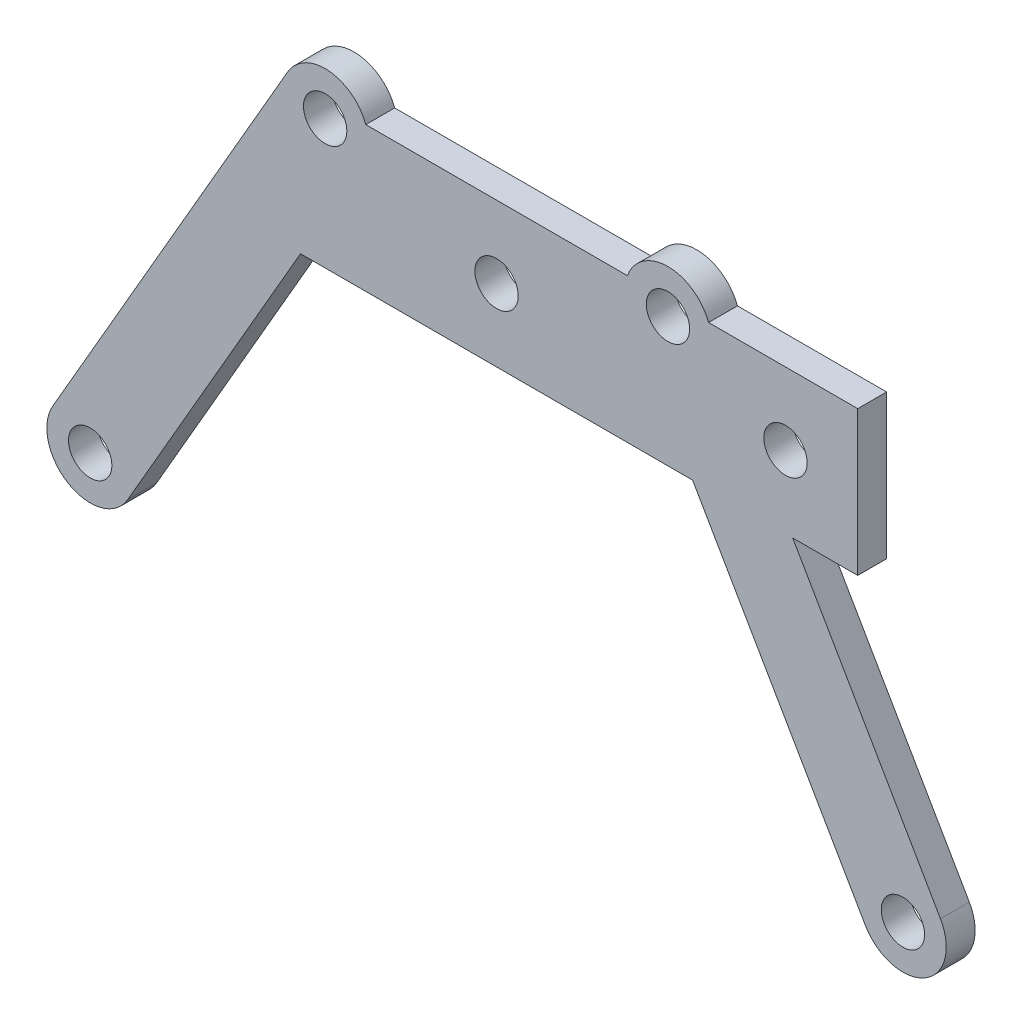
ISO-10303-21;
HEADER;
FILE_DESCRIPTION(('STEP AP214'),'2;1');
FILE_NAME('part.step','',(''),(''),'','','');
FILE_SCHEMA(('AUTOMOTIVE_DESIGN { 1 0 10303 214 1 1 1 1 }'));
ENDSEC;
DATA;
#1=APPLICATION_CONTEXT('core data for automotive mechanical design processes');
#2=APPLICATION_PROTOCOL_DEFINITION('international standard','automotive_design',2000,#1);
#3=PRODUCT_CONTEXT('',#1,'mechanical');
#4=PRODUCT('Part','Part','',(#3));
#5=PRODUCT_RELATED_PRODUCT_CATEGORY('part','',(#4));
#6=PRODUCT_DEFINITION_FORMATION('','',#4);
#7=PRODUCT_DEFINITION_CONTEXT('part definition',#1,'design');
#8=PRODUCT_DEFINITION('design','',#6,#7);
#9=PRODUCT_DEFINITION_SHAPE('','',#8);
#10=(LENGTH_UNIT() NAMED_UNIT(*) SI_UNIT(.MILLI.,.METRE.));
#11=(NAMED_UNIT(*) PLANE_ANGLE_UNIT() SI_UNIT($,.RADIAN.));
#12=(NAMED_UNIT(*) SI_UNIT($,.STERADIAN.) SOLID_ANGLE_UNIT());
#13=UNCERTAINTY_MEASURE_WITH_UNIT(LENGTH_MEASURE(1.E-05),#10,'distance_accuracy_value','');
#14=(GEOMETRIC_REPRESENTATION_CONTEXT(3) GLOBAL_UNCERTAINTY_ASSIGNED_CONTEXT((#13)) GLOBAL_UNIT_ASSIGNED_CONTEXT((#10,
#11,#12)) REPRESENTATION_CONTEXT('',''));
#15=CARTESIAN_POINT('',(0.,0.,0.));
#16=DIRECTION('',(0.,0.,1.));
#17=DIRECTION('',(1.,0.,0.));
#18=AXIS2_PLACEMENT_3D('',#15,#16,#17);
#19=CARTESIAN_POINT('',(-5.,5.,2.));
#20=DIRECTION('',(0.,-1.,0.));
#21=DIRECTION('',(0.,0.,-1.));
#22=AXIS2_PLACEMENT_3D('',#19,#20,#21);
#23=PLANE('',#22);
#24=DIRECTION('',(-1.,0.,0.));
#25=VECTOR('',#24,1.);
#26=CARTESIAN_POINT('',(-5.,5.,2.));
#27=LINE('',#26,#25);
#28=CARTESIAN_POINT('',(9.05236049633625,5.,2.));
#29=VERTEX_POINT('',#28);
#30=CARTESIAN_POINT('',(-9.05236049633653,5.,2.));
#31=VERTEX_POINT('',#30);
#32=EDGE_CURVE('E157',#29,#31,#27,.T.);
#33=ORIENTED_EDGE('',*,*,#32,.F.);
#34=DIRECTION('',(0.,0.,-1.));
#35=VECTOR('',#34,1.);
#36=CARTESIAN_POINT('',(9.05236049633625,5.,45.014566647965));
#37=LINE('',#36,#35);
#38=CARTESIAN_POINT('',(9.05236049633625,5.,0.));
#39=VERTEX_POINT('',#38);
#40=EDGE_CURVE('E325',#29,#39,#37,.T.);
#41=ORIENTED_EDGE('',*,*,#40,.T.);
#42=DIRECTION('',(-1.,0.,0.));
#43=VECTOR('',#42,1.);
#44=CARTESIAN_POINT('',(-5.,5.,0.));
#45=LINE('',#44,#43);
#46=CARTESIAN_POINT('',(-9.05236049633653,5.,0.));
#47=VERTEX_POINT('',#46);
#48=EDGE_CURVE('E143',#39,#47,#45,.T.);
#49=ORIENTED_EDGE('',*,*,#48,.T.);
#50=DIRECTION('',(0.,0.,-1.));
#51=VECTOR('',#50,1.);
#52=CARTESIAN_POINT('',(-9.05236049633653,5.,45.014566647965));
#53=LINE('',#52,#51);
#54=EDGE_CURVE('E254',#31,#47,#53,.T.);
#55=ORIENTED_EDGE('',*,*,#54,.F.);
#56=EDGE_LOOP('',(#33,#41,#49,#55));
#57=FACE_BOUND('',#56,.T.);
#58=ADVANCED_FACE('F36',(#57),#23,.F.);
#59=CARTESIAN_POINT('',(-5.,-5.,2.));
#60=DIRECTION('',(0.,1.,0.));
#61=DIRECTION('',(0.,0.,1.));
#62=AXIS2_PLACEMENT_3D('',#59,#60,#61);
#63=PLANE('',#62);
#64=DIRECTION('',(1.,0.,0.));
#65=VECTOR('',#64,1.);
#66=CARTESIAN_POINT('',(-5.,-5.,2.));
#67=LINE('',#66,#65);
#68=CARTESIAN_POINT('',(20.4965022908825,-5.,2.));
#69=VERTEX_POINT('',#68);
#70=CARTESIAN_POINT('',(25.,-5.,2.));
#71=VERTEX_POINT('',#70);
#72=EDGE_CURVE('E149',#69,#71,#67,.T.);
#73=ORIENTED_EDGE('',*,*,#72,.F.);
#74=DIRECTION('',(0.,0.,-1.));
#75=VECTOR('',#74,1.);
#76=CARTESIAN_POINT('',(20.4965022908825,-5.,45.014566647965));
#77=LINE('',#76,#75);
#78=CARTESIAN_POINT('',(20.4965022908825,-5.,0.));
#79=VERTEX_POINT('',#78);
#80=EDGE_CURVE('E216',#69,#79,#77,.T.);
#81=ORIENTED_EDGE('',*,*,#80,.T.);
#82=DIRECTION('',(1.,0.,0.));
#83=VECTOR('',#82,1.);
#84=CARTESIAN_POINT('',(-5.,-5.,0.));
#85=LINE('',#84,#83);
#86=CARTESIAN_POINT('',(25.,-5.,0.));
#87=VERTEX_POINT('',#86);
#88=EDGE_CURVE('E164',#79,#87,#85,.T.);
#89=ORIENTED_EDGE('',*,*,#88,.T.);
#90=DIRECTION('',(0.,0.,-1.));
#91=VECTOR('',#90,1.);
#92=CARTESIAN_POINT('',(25.,-5.,2.));
#93=LINE('',#92,#91);
#94=EDGE_CURVE('E11',#71,#87,#93,.T.);
#95=ORIENTED_EDGE('',*,*,#94,.F.);
#96=EDGE_LOOP('',(#73,#81,#89,#95));
#97=FACE_BOUND('',#96,.T.);
#98=ADVANCED_FACE('F295',(#97),#63,.F.);
#99=CARTESIAN_POINT('',(0.,0.,2.));
#100=DIRECTION('',(0.,0.,1.));
#101=DIRECTION('',(1.,0.,0.));
#102=AXIS2_PLACEMENT_3D('',#99,#100,#101);
#103=PLANE('',#102);
#104=CARTESIAN_POINT('',(11.863593391613,3.9526368306486,2.));
#105=DIRECTION('',(0.,0.,1.));
#106=DIRECTION('',(1.,0.,0.));
#107=AXIS2_PLACEMENT_3D('',#104,#105,#106);
#108=CIRCLE('',#107,1.5);
#109=CARTESIAN_POINT('',(13.363593391613,3.9526368306486,2.));
#110=VERTEX_POINT('',#109);
#111=EDGE_CURVE('E323',#110,#110,#108,.T.);
#112=ORIENTED_EDGE('',*,*,#111,.F.);
#113=EDGE_LOOP('',(#112));
#114=FACE_BOUND('',#113,.T.);
#115=CARTESIAN_POINT('',(0.,0.,2.));
#116=DIRECTION('',(0.,0.,1.));
#117=DIRECTION('',(1.,0.,0.));
#118=AXIS2_PLACEMENT_3D('',#115,#116,#117);
#119=CIRCLE('',#118,1.5);
#120=CARTESIAN_POINT('',(1.5,0.,2.));
#121=VERTEX_POINT('',#120);
#122=EDGE_CURVE('E168',#121,#121,#119,.T.);
#123=ORIENTED_EDGE('',*,*,#122,.F.);
#124=EDGE_LOOP('',(#123));
#125=FACE_BOUND('',#124,.T.);
#126=CARTESIAN_POINT('',(25.,5.,2.));
#127=VERTEX_POINT('',#126);
#128=CARTESIAN_POINT('',(14.6748262868898,5.,2.));
#129=VERTEX_POINT('',#128);
#130=EDGE_CURVE('E156',#127,#129,#27,.T.);
#131=ORIENTED_EDGE('',*,*,#130,.T.);
#132=CARTESIAN_POINT('',(11.863593391613,3.9526368306486,2.));
#133=DIRECTION('',(0.,0.,1.));
#134=DIRECTION('',(1.,0.,0.));
#135=AXIS2_PLACEMENT_3D('',#132,#133,#134);
#136=CIRCLE('',#135,3.);
#137=EDGE_CURVE('E51',#29,#129,#136,.F.);
#138=ORIENTED_EDGE('',*,*,#137,.F.);
#139=ORIENTED_EDGE('',*,*,#32,.T.);
#140=CARTESIAN_POINT('',(-11.863593391613,3.95263683064781,2.));
#141=DIRECTION('',(0.,0.,1.));
#142=DIRECTION('',(1.,0.,0.));
#143=AXIS2_PLACEMENT_3D('',#140,#141,#142);
#144=CIRCLE('',#143,3.);
#145=CARTESIAN_POINT('',(-14.4616696029663,5.45263683064781,2.));
#146=VERTEX_POINT('',#145);
#147=EDGE_CURVE('E204',#146,#31,#144,.F.);
#148=ORIENTED_EDGE('',*,*,#147,.F.);
#149=DIRECTION('',(0.500000000000001,0.866025403784438,0.));
#150=VECTOR('',#149,1.);
#151=CARTESIAN_POINT('',(-30.7257154784826,-22.7175169623773,2.));
#152=LINE('',#151,#150);
#153=CARTESIAN_POINT('',(-30.7257154784826,-22.7175169623773,2.));
#154=VERTEX_POINT('',#153);
#155=EDGE_CURVE('E255',#154,#146,#152,.T.);
#156=ORIENTED_EDGE('',*,*,#155,.F.);
#157=CARTESIAN_POINT('',(-28.1276392671292,-24.2175169623773,2.));
#158=DIRECTION('',(0.,0.,1.));
#159=DIRECTION('',(1.,0.,0.));
#160=AXIS2_PLACEMENT_3D('',#157,#158,#159);
#161=CIRCLE('',#160,3.);
#162=CARTESIAN_POINT('',(-25.5295630557759,-25.7175169623773,2.));
#163=VERTEX_POINT('',#162);
#164=EDGE_CURVE('E259',#163,#154,#161,.F.);
#165=ORIENTED_EDGE('',*,*,#164,.F.);
#166=DIRECTION('',(-0.500000000000001,-0.866025403784438,0.));
#167=VECTOR('',#166,1.);
#168=CARTESIAN_POINT('',(-25.5295630557759,-25.7175169623773,2.));
#169=LINE('',#168,#167);
#170=CARTESIAN_POINT('',(-13.5682990606067,-5.,2.));
#171=VERTEX_POINT('',#170);
#172=EDGE_CURVE('E263',#171,#163,#169,.T.);
#173=ORIENTED_EDGE('',*,*,#172,.F.);
#174=CARTESIAN_POINT('',(13.568299060607,-5.,2.));
#175=VERTEX_POINT('',#174);
#176=EDGE_CURVE('E151',#171,#175,#67,.T.);
#177=ORIENTED_EDGE('',*,*,#176,.T.);
#178=DIRECTION('',(-0.499999999999987,0.866025403784446,0.));
#179=VECTOR('',#178,1.);
#180=CARTESIAN_POINT('',(25.5295630557755,-25.7175169623767,2.));
#181=LINE('',#180,#179);
#182=CARTESIAN_POINT('',(25.5295630557755,-25.7175169623767,2.));
#183=VERTEX_POINT('',#182);
#184=EDGE_CURVE('E214',#183,#175,#181,.T.);
#185=ORIENTED_EDGE('',*,*,#184,.F.);
#186=CARTESIAN_POINT('',(28.1276392671288,-24.2175169623767,2.));
#187=DIRECTION('',(0.,0.,1.));
#188=DIRECTION('',(1.,0.,0.));
#189=AXIS2_PLACEMENT_3D('',#186,#187,#188);
#190=CIRCLE('',#189,3.);
#191=CARTESIAN_POINT('',(30.7257154784821,-22.7175169623768,2.));
#192=VERTEX_POINT('',#191);
#193=EDGE_CURVE('E133',#192,#183,#190,.F.);
#194=ORIENTED_EDGE('',*,*,#193,.F.);
#195=DIRECTION('',(0.499999999999987,-0.866025403784446,0.));
#196=VECTOR('',#195,1.);
#197=CARTESIAN_POINT('',(30.7257154784821,-22.7175169623768,2.));
#198=LINE('',#197,#196);
#199=EDGE_CURVE('E220',#69,#192,#198,.T.);
#200=ORIENTED_EDGE('',*,*,#199,.F.);
#201=ORIENTED_EDGE('',*,*,#72,.T.);
#202=DIRECTION('',(0.,1.,0.));
#203=VECTOR('',#202,1.);
#204=CARTESIAN_POINT('',(25.,5.,2.));
#205=LINE('',#204,#203);
#206=EDGE_CURVE('E160',#71,#127,#205,.T.);
#207=ORIENTED_EDGE('',*,*,#206,.T.);
#208=EDGE_LOOP('',(#131,#138,#139,#148,#156,#165,#173,#177,#185,#194,#200,#201,#207));
#209=FACE_BOUND('',#208,.T.);
#210=CARTESIAN_POINT('',(20.,0.,2.));
#211=DIRECTION('',(0.,0.,1.));
#212=DIRECTION('',(1.,0.,0.));
#213=AXIS2_PLACEMENT_3D('',#210,#211,#212);
#214=CIRCLE('',#213,1.5);
#215=CARTESIAN_POINT('',(21.5,0.,2.));
#216=VERTEX_POINT('',#215);
#217=EDGE_CURVE('E179',#216,#216,#214,.T.);
#218=ORIENTED_EDGE('',*,*,#217,.F.);
#219=EDGE_LOOP('',(#218));
#220=FACE_BOUND('',#219,.T.);
#221=CARTESIAN_POINT('',(-28.1276392671292,-24.2175169623773,2.));
#222=DIRECTION('',(0.,0.,1.));
#223=DIRECTION('',(1.,0.,0.));
#224=AXIS2_PLACEMENT_3D('',#221,#222,#223);
#225=CIRCLE('',#224,1.5);
#226=CARTESIAN_POINT('',(-26.6276392671292,-24.2175169623773,2.));
#227=VERTEX_POINT('',#226);
#228=EDGE_CURVE('E230',#227,#227,#225,.F.);
#229=ORIENTED_EDGE('',*,*,#228,.T.);
#230=EDGE_LOOP('',(#229));
#231=FACE_BOUND('',#230,.T.);
#232=CARTESIAN_POINT('',(-11.863593391613,3.95263683064781,2.));
#233=DIRECTION('',(0.,0.,1.));
#234=DIRECTION('',(1.,0.,0.));
#235=AXIS2_PLACEMENT_3D('',#232,#233,#234);
#236=CIRCLE('',#235,1.5);
#237=CARTESIAN_POINT('',(-10.363593391613,3.95263683064781,2.));
#238=VERTEX_POINT('',#237);
#239=EDGE_CURVE('E247',#238,#238,#236,.F.);
#240=ORIENTED_EDGE('',*,*,#239,.T.);
#241=EDGE_LOOP('',(#240));
#242=FACE_BOUND('',#241,.T.);
#243=CARTESIAN_POINT('',(28.1276392671288,-24.2175169623767,2.));
#244=DIRECTION('',(0.,0.,1.));
#245=DIRECTION('',(1.,0.,0.));
#246=AXIS2_PLACEMENT_3D('',#243,#244,#245);
#247=CIRCLE('',#246,1.5);
#248=CARTESIAN_POINT('',(29.6276392671288,-24.2175169623767,2.));
#249=VERTEX_POINT('',#248);
#250=EDGE_CURVE('E200',#249,#249,#247,.F.);
#251=ORIENTED_EDGE('',*,*,#250,.T.);
#252=EDGE_LOOP('',(#251));
#253=FACE_BOUND('',#252,.T.);
#254=ADVANCED_FACE('F187',(#114,#125,#209,#220,#231,#242,#253),#103,.T.);
#255=CARTESIAN_POINT('',(0.,0.,0.));
#256=DIRECTION('',(0.,0.,1.));
#257=DIRECTION('',(1.,0.,0.));
#258=AXIS2_PLACEMENT_3D('',#255,#256,#257);
#259=PLANE('',#258);
#260=ORIENTED_EDGE('',*,*,#48,.F.);
#261=CARTESIAN_POINT('',(11.863593391613,3.9526368306486,0.));
#262=DIRECTION('',(0.,0.,-1.));
#263=DIRECTION('',(-1.,0.,0.));
#264=AXIS2_PLACEMENT_3D('',#261,#262,#263);
#265=CIRCLE('',#264,3.);
#266=CARTESIAN_POINT('',(14.6748262868898,5.,0.));
#267=VERTEX_POINT('',#266);
#268=EDGE_CURVE('E56',#39,#267,#265,.T.);
#269=ORIENTED_EDGE('',*,*,#268,.T.);
#270=CARTESIAN_POINT('',(25.,5.,0.));
#271=VERTEX_POINT('',#270);
#272=EDGE_CURVE('E141',#271,#267,#45,.T.);
#273=ORIENTED_EDGE('',*,*,#272,.F.);
#274=DIRECTION('',(0.,1.,0.));
#275=VECTOR('',#274,1.);
#276=CARTESIAN_POINT('',(25.,5.,0.));
#277=LINE('',#276,#275);
#278=EDGE_CURVE('E153',#87,#271,#277,.T.);
#279=ORIENTED_EDGE('',*,*,#278,.F.);
#280=ORIENTED_EDGE('',*,*,#88,.F.);
#281=DIRECTION('',(0.499999999999987,-0.866025403784446,0.));
#282=VECTOR('',#281,1.);
#283=CARTESIAN_POINT('',(30.7257154784821,-22.7175169623768,0.));
#284=LINE('',#283,#282);
#285=CARTESIAN_POINT('',(30.7257154784821,-22.7175169623768,0.));
#286=VERTEX_POINT('',#285);
#287=EDGE_CURVE('E195',#79,#286,#284,.T.);
#288=ORIENTED_EDGE('',*,*,#287,.T.);
#289=CARTESIAN_POINT('',(28.1276392671288,-24.2175169623767,0.));
#290=DIRECTION('',(0.,0.,-1.));
#291=DIRECTION('',(1.,0.,0.));
#292=AXIS2_PLACEMENT_3D('',#289,#290,#291);
#293=CIRCLE('',#292,3.);
#294=CARTESIAN_POINT('',(25.5295630557755,-25.7175169623767,0.));
#295=VERTEX_POINT('',#294);
#296=EDGE_CURVE('E198',#286,#295,#293,.T.);
#297=ORIENTED_EDGE('',*,*,#296,.T.);
#298=DIRECTION('',(-0.499999999999987,0.866025403784446,0.));
#299=VECTOR('',#298,1.);
#300=CARTESIAN_POINT('',(25.5295630557755,-25.7175169623767,0.));
#301=LINE('',#300,#299);
#302=CARTESIAN_POINT('',(13.568299060607,-5.,0.));
#303=VERTEX_POINT('',#302);
#304=EDGE_CURVE('E201',#295,#303,#301,.T.);
#305=ORIENTED_EDGE('',*,*,#304,.T.);
#306=CARTESIAN_POINT('',(-13.5682990606067,-5.,0.));
#307=VERTEX_POINT('',#306);
#308=EDGE_CURVE('E162',#307,#303,#85,.T.);
#309=ORIENTED_EDGE('',*,*,#308,.F.);
#310=DIRECTION('',(-0.500000000000001,-0.866025403784438,0.));
#311=VECTOR('',#310,1.);
#312=CARTESIAN_POINT('',(-25.5295630557759,-25.7175169623773,0.));
#313=LINE('',#312,#311);
#314=CARTESIAN_POINT('',(-25.5295630557759,-25.7175169623773,0.));
#315=VERTEX_POINT('',#314);
#316=EDGE_CURVE('E237',#307,#315,#313,.T.);
#317=ORIENTED_EDGE('',*,*,#316,.T.);
#318=CARTESIAN_POINT('',(-28.1276392671292,-24.2175169623773,0.));
#319=DIRECTION('',(0.,0.,-1.));
#320=DIRECTION('',(1.,0.,0.));
#321=AXIS2_PLACEMENT_3D('',#318,#319,#320);
#322=CIRCLE('',#321,3.);
#323=CARTESIAN_POINT('',(-30.7257154784826,-22.7175169623773,0.));
#324=VERTEX_POINT('',#323);
#325=EDGE_CURVE('E234',#315,#324,#322,.T.);
#326=ORIENTED_EDGE('',*,*,#325,.T.);
#327=DIRECTION('',(0.500000000000001,0.866025403784438,0.));
#328=VECTOR('',#327,1.);
#329=CARTESIAN_POINT('',(-30.7257154784826,-22.7175169623773,0.));
#330=LINE('',#329,#328);
#331=CARTESIAN_POINT('',(-14.4616696029663,5.45263683064781,0.));
#332=VERTEX_POINT('',#331);
#333=EDGE_CURVE('E231',#324,#332,#330,.T.);
#334=ORIENTED_EDGE('',*,*,#333,.T.);
#335=CARTESIAN_POINT('',(-11.863593391613,3.95263683064781,0.));
#336=DIRECTION('',(0.,0.,-1.));
#337=DIRECTION('',(-1.,0.,0.));
#338=AXIS2_PLACEMENT_3D('',#335,#336,#337);
#339=CIRCLE('',#338,3.);
#340=EDGE_CURVE('E228',#332,#47,#339,.T.);
#341=ORIENTED_EDGE('',*,*,#340,.T.);
#342=EDGE_LOOP('',(#260,#269,#273,#279,#280,#288,#297,#305,#309,#317,#326,#334,#341));
#343=FACE_BOUND('',#342,.T.);
#344=CARTESIAN_POINT('',(11.863593391613,3.9526368306486,0.));
#345=DIRECTION('',(0.,0.,1.));
#346=DIRECTION('',(-1.,0.,0.));
#347=AXIS2_PLACEMENT_3D('',#344,#345,#346);
#348=CIRCLE('',#347,1.5);
#349=CARTESIAN_POINT('',(10.363593391613,3.9526368306486,0.));
#350=VERTEX_POINT('',#349);
#351=EDGE_CURVE('E144',#350,#350,#348,.T.);
#352=ORIENTED_EDGE('',*,*,#351,.T.);
#353=EDGE_LOOP('',(#352));
#354=FACE_BOUND('',#353,.T.);
#355=CARTESIAN_POINT('',(0.,0.,0.));
#356=DIRECTION('',(0.,0.,1.));
#357=DIRECTION('',(1.,0.,0.));
#358=AXIS2_PLACEMENT_3D('',#355,#356,#357);
#359=CIRCLE('',#358,1.5);
#360=CARTESIAN_POINT('',(1.5,0.,0.));
#361=VERTEX_POINT('',#360);
#362=EDGE_CURVE('E174',#361,#361,#359,.T.);
#363=ORIENTED_EDGE('',*,*,#362,.T.);
#364=EDGE_LOOP('',(#363));
#365=FACE_BOUND('',#364,.T.);
#366=CARTESIAN_POINT('',(20.,0.,0.));
#367=DIRECTION('',(0.,0.,1.));
#368=DIRECTION('',(1.,0.,0.));
#369=AXIS2_PLACEMENT_3D('',#366,#367,#368);
#370=CIRCLE('',#369,1.5);
#371=CARTESIAN_POINT('',(21.5,0.,0.));
#372=VERTEX_POINT('',#371);
#373=EDGE_CURVE('E182',#372,#372,#370,.T.);
#374=ORIENTED_EDGE('',*,*,#373,.T.);
#375=EDGE_LOOP('',(#374));
#376=FACE_BOUND('',#375,.T.);
#377=CARTESIAN_POINT('',(-28.1276392671292,-24.2175169623773,0.));
#378=DIRECTION('',(0.,0.,-1.));
#379=DIRECTION('',(-1.,0.,0.));
#380=AXIS2_PLACEMENT_3D('',#377,#378,#379);
#381=CIRCLE('',#380,1.5);
#382=CARTESIAN_POINT('',(-29.6276392671293,-24.2175169623773,0.));
#383=VERTEX_POINT('',#382);
#384=EDGE_CURVE('E240',#383,#383,#381,.T.);
#385=ORIENTED_EDGE('',*,*,#384,.F.);
#386=EDGE_LOOP('',(#385));
#387=FACE_BOUND('',#386,.T.);
#388=CARTESIAN_POINT('',(-11.863593391613,3.95263683064781,0.));
#389=DIRECTION('',(0.,0.,-1.));
#390=DIRECTION('',(-1.,0.,0.));
#391=AXIS2_PLACEMENT_3D('',#388,#389,#390);
#392=CIRCLE('',#391,1.5);
#393=CARTESIAN_POINT('',(-13.363593391613,3.95263683064781,0.));
#394=VERTEX_POINT('',#393);
#395=EDGE_CURVE('E241',#394,#394,#392,.T.);
#396=ORIENTED_EDGE('',*,*,#395,.F.);
#397=EDGE_LOOP('',(#396));
#398=FACE_BOUND('',#397,.T.);
#399=CARTESIAN_POINT('',(28.1276392671288,-24.2175169623767,0.));
#400=DIRECTION('',(0.,0.,-1.));
#401=DIRECTION('',(-1.,0.,0.));
#402=AXIS2_PLACEMENT_3D('',#399,#400,#401);
#403=CIRCLE('',#402,1.5);
#404=CARTESIAN_POINT('',(26.6276392671288,-24.2175169623767,0.));
#405=VERTEX_POINT('',#404);
#406=EDGE_CURVE('E210',#405,#405,#403,.T.);
#407=ORIENTED_EDGE('',*,*,#406,.F.);
#408=EDGE_LOOP('',(#407));
#409=FACE_BOUND('',#408,.T.);
#410=ADVANCED_FACE('F138',(#343,#354,#365,#376,#387,#398,#409),#259,.F.);
#411=ORIENTED_EDGE('',*,*,#308,.T.);
#412=DIRECTION('',(0.,0.,-1.));
#413=VECTOR('',#412,1.);
#414=CARTESIAN_POINT('',(13.568299060607,-5.,45.014566647965));
#415=LINE('',#414,#413);
#416=EDGE_CURVE('E212',#175,#303,#415,.T.);
#417=ORIENTED_EDGE('',*,*,#416,.F.);
#418=ORIENTED_EDGE('',*,*,#176,.F.);
#419=DIRECTION('',(0.,0.,-1.));
#420=VECTOR('',#419,1.);
#421=CARTESIAN_POINT('',(-13.5682990606067,-5.,45.014566647965));
#422=LINE('',#421,#420);
#423=EDGE_CURVE('E244',#171,#307,#422,.T.);
#424=ORIENTED_EDGE('',*,*,#423,.T.);
#425=EDGE_LOOP('',(#411,#417,#418,#424));
#426=FACE_BOUND('',#425,.T.);
#427=ADVANCED_FACE('F38',(#426),#63,.F.);
#428=CARTESIAN_POINT('',(25.,5.,2.));
#429=DIRECTION('',(-1.,0.,0.));
#430=DIRECTION('',(0.,0.,1.));
#431=AXIS2_PLACEMENT_3D('',#428,#429,#430);
#432=PLANE('',#431);
#433=ORIENTED_EDGE('',*,*,#278,.T.);
#434=DIRECTION('',(0.,0.,-1.));
#435=VECTOR('',#434,1.);
#436=CARTESIAN_POINT('',(25.,5.,2.));
#437=LINE('',#436,#435);
#438=EDGE_CURVE('E44',#127,#271,#437,.T.);
#439=ORIENTED_EDGE('',*,*,#438,.F.);
#440=ORIENTED_EDGE('',*,*,#206,.F.);
#441=ORIENTED_EDGE('',*,*,#94,.T.);
#442=EDGE_LOOP('',(#433,#439,#440,#441));
#443=FACE_BOUND('',#442,.T.);
#444=ADVANCED_FACE('F192',(#443),#432,.F.);
#445=ORIENTED_EDGE('',*,*,#272,.T.);
#446=DIRECTION('',(0.,0.,-1.));
#447=VECTOR('',#446,1.);
#448=CARTESIAN_POINT('',(14.6748262868898,5.,45.014566647965));
#449=LINE('',#448,#447);
#450=EDGE_CURVE('E127',#129,#267,#449,.T.);
#451=ORIENTED_EDGE('',*,*,#450,.F.);
#452=ORIENTED_EDGE('',*,*,#130,.F.);
#453=ORIENTED_EDGE('',*,*,#438,.T.);
#454=EDGE_LOOP('',(#445,#451,#452,#453));
#455=FACE_BOUND('',#454,.T.);
#456=ADVANCED_FACE('F147',(#455),#23,.F.);
#457=CARTESIAN_POINT('',(0.,0.,2.));
#458=DIRECTION('',(0.,0.,-1.));
#459=DIRECTION('',(-1.,0.,0.));
#460=AXIS2_PLACEMENT_3D('',#457,#458,#459);
#461=CYLINDRICAL_SURFACE('',#460,1.5);
#462=ORIENTED_EDGE('',*,*,#122,.T.);
#463=EDGE_LOOP('',(#462));
#464=FACE_BOUND('',#463,.T.);
#465=ORIENTED_EDGE('',*,*,#362,.F.);
#466=EDGE_LOOP('',(#465));
#467=FACE_BOUND('',#466,.T.);
#468=ADVANCED_FACE('F283',(#464,#467),#461,.F.);
#469=CARTESIAN_POINT('',(20.,0.,2.));
#470=DIRECTION('',(0.,0.,-1.));
#471=DIRECTION('',(-1.,0.,0.));
#472=AXIS2_PLACEMENT_3D('',#469,#470,#471);
#473=CYLINDRICAL_SURFACE('',#472,1.5);
#474=ORIENTED_EDGE('',*,*,#217,.T.);
#475=EDGE_LOOP('',(#474));
#476=FACE_BOUND('',#475,.T.);
#477=ORIENTED_EDGE('',*,*,#373,.F.);
#478=EDGE_LOOP('',(#477));
#479=FACE_BOUND('',#478,.T.);
#480=ADVANCED_FACE('F280',(#476,#479),#473,.F.);
#481=CARTESIAN_POINT('',(-11.863593391613,3.95263683064781,45.014566647965));
#482=DIRECTION('',(0.,0.,-1.));
#483=DIRECTION('',(-1.,0.,0.));
#484=AXIS2_PLACEMENT_3D('',#481,#482,#483);
#485=CYLINDRICAL_SURFACE('',#484,3.);
#486=DIRECTION('',(0.,0.,-1.));
#487=VECTOR('',#486,1.);
#488=CARTESIAN_POINT('',(-14.4616696029663,5.45263683064781,45.014566647965));
#489=LINE('',#488,#487);
#490=EDGE_CURVE('E258',#146,#332,#489,.T.);
#491=ORIENTED_EDGE('',*,*,#490,.F.);
#492=ORIENTED_EDGE('',*,*,#147,.T.);
#493=ORIENTED_EDGE('',*,*,#54,.T.);
#494=ORIENTED_EDGE('',*,*,#340,.F.);
#495=EDGE_LOOP('',(#491,#492,#493,#494));
#496=FACE_BOUND('',#495,.T.);
#497=ADVANCED_FACE('F282',(#496),#485,.T.);
#498=CARTESIAN_POINT('',(-30.7257154784826,-22.7175169623773,45.014566647965));
#499=DIRECTION('',(-0.866025403784438,0.500000000000001,0.));
#500=DIRECTION('',(-0.500000000000001,-0.866025403784438,0.));
#501=AXIS2_PLACEMENT_3D('',#498,#499,#500);
#502=PLANE('',#501);
#503=DIRECTION('',(0.,0.,-1.));
#504=VECTOR('',#503,1.);
#505=CARTESIAN_POINT('',(-30.7257154784826,-22.7175169623773,45.014566647965));
#506=LINE('',#505,#504);
#507=EDGE_CURVE('E262',#154,#324,#506,.T.);
#508=ORIENTED_EDGE('',*,*,#507,.F.);
#509=ORIENTED_EDGE('',*,*,#155,.T.);
#510=ORIENTED_EDGE('',*,*,#490,.T.);
#511=ORIENTED_EDGE('',*,*,#333,.F.);
#512=EDGE_LOOP('',(#508,#509,#510,#511));
#513=FACE_BOUND('',#512,.T.);
#514=ADVANCED_FACE('F289',(#513),#502,.T.);
#515=CARTESIAN_POINT('',(-28.1276392671292,-24.2175169623773,45.014566647965));
#516=DIRECTION('',(0.,0.,-1.));
#517=DIRECTION('',(-1.,0.,0.));
#518=AXIS2_PLACEMENT_3D('',#515,#516,#517);
#519=CYLINDRICAL_SURFACE('',#518,3.);
#520=DIRECTION('',(0.,0.,-1.));
#521=VECTOR('',#520,1.);
#522=CARTESIAN_POINT('',(-25.5295630557759,-25.7175169623773,45.014566647965));
#523=LINE('',#522,#521);
#524=EDGE_CURVE('E266',#163,#315,#523,.T.);
#525=ORIENTED_EDGE('',*,*,#524,.F.);
#526=ORIENTED_EDGE('',*,*,#164,.T.);
#527=ORIENTED_EDGE('',*,*,#507,.T.);
#528=ORIENTED_EDGE('',*,*,#325,.F.);
#529=EDGE_LOOP('',(#525,#526,#527,#528));
#530=FACE_BOUND('',#529,.T.);
#531=ADVANCED_FACE('F361',(#530),#519,.T.);
#532=CARTESIAN_POINT('',(-25.5295630557759,-25.7175169623773,45.014566647965));
#533=DIRECTION('',(0.866025403784438,-0.500000000000001,0.));
#534=DIRECTION('',(0.500000000000001,0.866025403784438,0.));
#535=AXIS2_PLACEMENT_3D('',#532,#533,#534);
#536=PLANE('',#535);
#537=ORIENTED_EDGE('',*,*,#423,.F.);
#538=ORIENTED_EDGE('',*,*,#172,.T.);
#539=ORIENTED_EDGE('',*,*,#524,.T.);
#540=ORIENTED_EDGE('',*,*,#316,.F.);
#541=EDGE_LOOP('',(#537,#538,#539,#540));
#542=FACE_BOUND('',#541,.T.);
#543=ADVANCED_FACE('F357',(#542),#536,.T.);
#544=CARTESIAN_POINT('',(-11.863593391613,3.95263683064781,45.014566647965));
#545=DIRECTION('',(0.,0.,-1.));
#546=DIRECTION('',(-1.,0.,0.));
#547=AXIS2_PLACEMENT_3D('',#544,#545,#546);
#548=CYLINDRICAL_SURFACE('',#547,1.5);
#549=ORIENTED_EDGE('',*,*,#395,.T.);
#550=EDGE_LOOP('',(#549));
#551=FACE_BOUND('',#550,.T.);
#552=ORIENTED_EDGE('',*,*,#239,.F.);
#553=EDGE_LOOP('',(#552));
#554=FACE_BOUND('',#553,.T.);
#555=ADVANCED_FACE('F360',(#551,#554),#548,.F.);
#556=CARTESIAN_POINT('',(-28.1276392671292,-24.2175169623773,45.014566647965));
#557=DIRECTION('',(0.,0.,-1.));
#558=DIRECTION('',(-1.,0.,0.));
#559=AXIS2_PLACEMENT_3D('',#556,#557,#558);
#560=CYLINDRICAL_SURFACE('',#559,1.5);
#561=ORIENTED_EDGE('',*,*,#384,.T.);
#562=EDGE_LOOP('',(#561));
#563=FACE_BOUND('',#562,.T.);
#564=ORIENTED_EDGE('',*,*,#228,.F.);
#565=EDGE_LOOP('',(#564));
#566=FACE_BOUND('',#565,.T.);
#567=ADVANCED_FACE('F354',(#563,#566),#560,.F.);
#568=CARTESIAN_POINT('',(28.1276392671288,-24.2175169623767,45.014566647965));
#569=DIRECTION('',(0.,0.,-1.));
#570=DIRECTION('',(-1.,0.,0.));
#571=AXIS2_PLACEMENT_3D('',#568,#569,#570);
#572=CYLINDRICAL_SURFACE('',#571,3.);
#573=DIRECTION('',(0.,0.,-1.));
#574=VECTOR('',#573,1.);
#575=CARTESIAN_POINT('',(30.7257154784821,-22.7175169623768,45.014566647965));
#576=LINE('',#575,#574);
#577=EDGE_CURVE('E223',#192,#286,#576,.T.);
#578=ORIENTED_EDGE('',*,*,#577,.F.);
#579=ORIENTED_EDGE('',*,*,#193,.T.);
#580=DIRECTION('',(0.,0.,-1.));
#581=VECTOR('',#580,1.);
#582=CARTESIAN_POINT('',(25.5295630557755,-25.7175169623767,45.014566647965));
#583=LINE('',#582,#581);
#584=EDGE_CURVE('E219',#183,#295,#583,.T.);
#585=ORIENTED_EDGE('',*,*,#584,.T.);
#586=ORIENTED_EDGE('',*,*,#296,.F.);
#587=EDGE_LOOP('',(#578,#579,#585,#586));
#588=FACE_BOUND('',#587,.T.);
#589=ADVANCED_FACE('F352',(#588),#572,.T.);
#590=CARTESIAN_POINT('',(30.7257154784821,-22.7175169623768,45.014566647965));
#591=DIRECTION('',(0.866025403784446,0.499999999999987,0.));
#592=DIRECTION('',(-0.499999999999987,0.866025403784446,0.));
#593=AXIS2_PLACEMENT_3D('',#590,#591,#592);
#594=PLANE('',#593);
#595=ORIENTED_EDGE('',*,*,#80,.F.);
#596=ORIENTED_EDGE('',*,*,#199,.T.);
#597=ORIENTED_EDGE('',*,*,#577,.T.);
#598=ORIENTED_EDGE('',*,*,#287,.F.);
#599=EDGE_LOOP('',(#595,#596,#597,#598));
#600=FACE_BOUND('',#599,.T.);
#601=ADVANCED_FACE('F348',(#600),#594,.T.);
#602=CARTESIAN_POINT('',(25.5295630557755,-25.7175169623767,45.014566647965));
#603=DIRECTION('',(-0.866025403784446,-0.499999999999987,0.));
#604=DIRECTION('',(0.499999999999987,-0.866025403784446,0.));
#605=AXIS2_PLACEMENT_3D('',#602,#603,#604);
#606=PLANE('',#605);
#607=ORIENTED_EDGE('',*,*,#584,.F.);
#608=ORIENTED_EDGE('',*,*,#184,.T.);
#609=ORIENTED_EDGE('',*,*,#416,.T.);
#610=ORIENTED_EDGE('',*,*,#304,.F.);
#611=EDGE_LOOP('',(#607,#608,#609,#610));
#612=FACE_BOUND('',#611,.T.);
#613=ADVANCED_FACE('F342',(#612),#606,.T.);
#614=CARTESIAN_POINT('',(28.1276392671288,-24.2175169623767,45.014566647965));
#615=DIRECTION('',(0.,0.,-1.));
#616=DIRECTION('',(-1.,0.,0.));
#617=AXIS2_PLACEMENT_3D('',#614,#615,#616);
#618=CYLINDRICAL_SURFACE('',#617,1.5);
#619=ORIENTED_EDGE('',*,*,#406,.T.);
#620=EDGE_LOOP('',(#619));
#621=FACE_BOUND('',#620,.T.);
#622=ORIENTED_EDGE('',*,*,#250,.F.);
#623=EDGE_LOOP('',(#622));
#624=FACE_BOUND('',#623,.T.);
#625=ADVANCED_FACE('F335',(#621,#624),#618,.F.);
#626=CARTESIAN_POINT('',(11.863593391613,3.9526368306486,45.014566647965));
#627=DIRECTION('',(0.,0.,-1.));
#628=DIRECTION('',(-1.,0.,0.));
#629=AXIS2_PLACEMENT_3D('',#626,#627,#628);
#630=CYLINDRICAL_SURFACE('',#629,1.5);
#631=ORIENTED_EDGE('',*,*,#351,.F.);
#632=EDGE_LOOP('',(#631));
#633=FACE_BOUND('',#632,.T.);
#634=ORIENTED_EDGE('',*,*,#111,.T.);
#635=EDGE_LOOP('',(#634));
#636=FACE_BOUND('',#635,.T.);
#637=ADVANCED_FACE('F333',(#633,#636),#630,.F.);
#638=CARTESIAN_POINT('',(11.863593391613,3.9526368306486,45.014566647965));
#639=DIRECTION('',(0.,0.,-1.));
#640=DIRECTION('',(-1.,0.,0.));
#641=AXIS2_PLACEMENT_3D('',#638,#639,#640);
#642=CYLINDRICAL_SURFACE('',#641,3.);
#643=ORIENTED_EDGE('',*,*,#40,.F.);
#644=ORIENTED_EDGE('',*,*,#137,.T.);
#645=ORIENTED_EDGE('',*,*,#450,.T.);
#646=ORIENTED_EDGE('',*,*,#268,.F.);
#647=EDGE_LOOP('',(#643,#644,#645,#646));
#648=FACE_BOUND('',#647,.T.);
#649=ADVANCED_FACE('F128',(#648),#642,.T.);
#650=CLOSED_SHELL('',(#58,#98,#254,#410,#427,#444,#456,#468,#480,#497,#514,#531,#543,#555,#567,
#589,#601,#613,#625,#637,#649));
#651=MANIFOLD_SOLID_BREP('B2',#650);
#652=ADVANCED_BREP_SHAPE_REPRESENTATION('',(#18,#651),#14);
#653=SHAPE_DEFINITION_REPRESENTATION(#9,#652);
ENDSEC;
END-ISO-10303-21;
